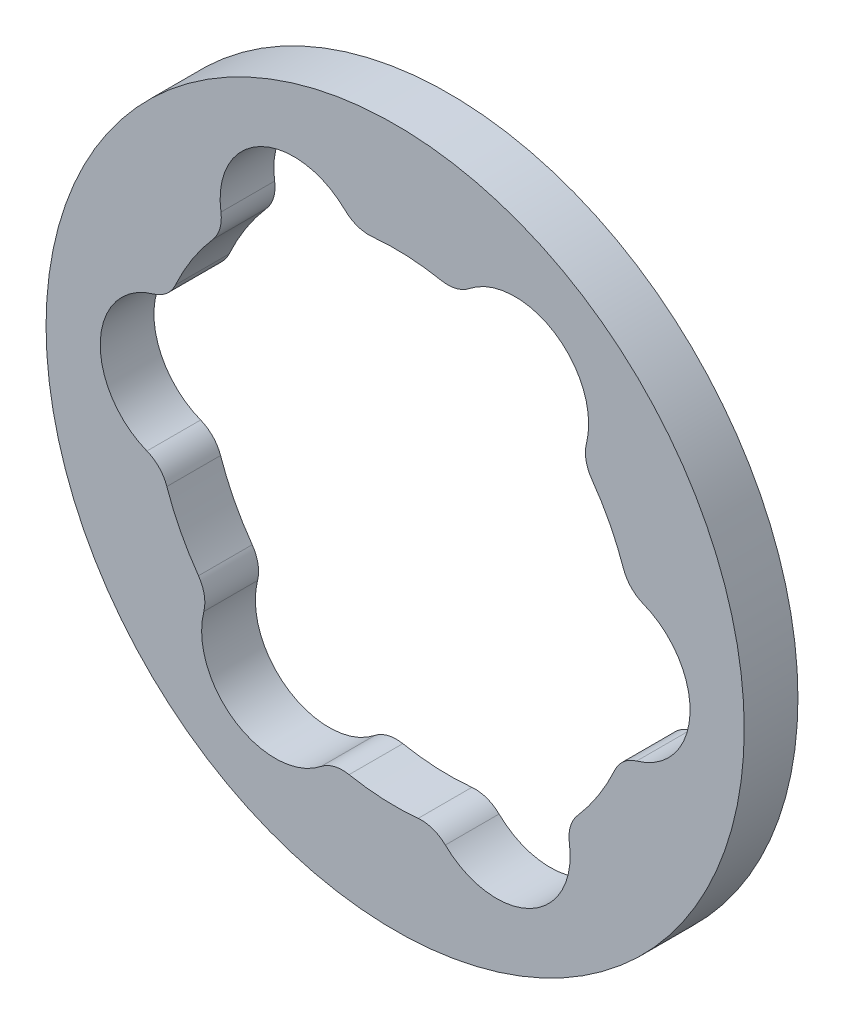
ISO-10303-21;
HEADER;
FILE_DESCRIPTION(('STEP AP214'),'2;1');
FILE_NAME('part.step','',(''),(''),'','','');
FILE_SCHEMA(('AUTOMOTIVE_DESIGN { 1 0 10303 214 1 1 1 1 }'));
ENDSEC;
DATA;
#1=APPLICATION_CONTEXT('core data for automotive mechanical design processes');
#2=APPLICATION_PROTOCOL_DEFINITION('international standard','automotive_design',2000,#1);
#3=PRODUCT_CONTEXT('',#1,'mechanical');
#4=PRODUCT('Part','Part','',(#3));
#5=PRODUCT_RELATED_PRODUCT_CATEGORY('part','',(#4));
#6=PRODUCT_DEFINITION_FORMATION('','',#4);
#7=PRODUCT_DEFINITION_CONTEXT('part definition',#1,'design');
#8=PRODUCT_DEFINITION('design','',#6,#7);
#9=PRODUCT_DEFINITION_SHAPE('','',#8);
#10=(LENGTH_UNIT() NAMED_UNIT(*) SI_UNIT(.MILLI.,.METRE.));
#11=(NAMED_UNIT(*) PLANE_ANGLE_UNIT() SI_UNIT($,.RADIAN.));
#12=(NAMED_UNIT(*) SI_UNIT($,.STERADIAN.) SOLID_ANGLE_UNIT());
#13=UNCERTAINTY_MEASURE_WITH_UNIT(LENGTH_MEASURE(1.E-05),#10,'distance_accuracy_value','');
#14=(GEOMETRIC_REPRESENTATION_CONTEXT(3) GLOBAL_UNCERTAINTY_ASSIGNED_CONTEXT((#13)) GLOBAL_UNIT_ASSIGNED_CONTEXT((#10,
#11,#12)) REPRESENTATION_CONTEXT('',''));
#15=CARTESIAN_POINT('',(0.,0.,0.));
#16=DIRECTION('',(0.,0.,1.));
#17=DIRECTION('',(1.,0.,0.));
#18=AXIS2_PLACEMENT_3D('',#15,#16,#17);
#19=CARTESIAN_POINT('',(0.,0.,3.175));
#20=DIRECTION('',(0.,0.,1.));
#21=DIRECTION('',(1.,0.,0.));
#22=AXIS2_PLACEMENT_3D('',#19,#20,#21);
#23=PLANE('',#22);
#24=CARTESIAN_POINT('',(596.895342550677,221.989731649152,3.175));
#25=DIRECTION('',(0.,0.,1.));
#26=DIRECTION('',(1.,0.,0.));
#27=AXIS2_PLACEMENT_3D('',#24,#25,#26);
#28=CIRCLE('',#27,20.6375);
#29=CARTESIAN_POINT('',(617.532842550677,221.989731649152,3.175));
#30=VERTEX_POINT('',#29);
#31=EDGE_CURVE('E244',#30,#30,#28,.T.);
#32=ORIENTED_EDGE('',*,*,#31,.T.);
#33=EDGE_LOOP('',(#32));
#34=FACE_BOUND('',#33,.T.);
#35=CARTESIAN_POINT('',(603.982524474659,233.003358987227,3.175));
#36=DIRECTION('',(0.,0.,1.));
#37=DIRECTION('',(1.,0.,0.));
#38=AXIS2_PLACEMENT_3D('',#35,#36,#37);
#39=CIRCLE('',#38,4.35292499999982);
#40=CARTESIAN_POINT('',(608.204995238954,231.945674393266,3.175));
#41=VERTEX_POINT('',#40);
#42=CARTESIAN_POINT('',(601.270344718915,236.408067055205,3.175));
#43=VERTEX_POINT('',#42);
#44=EDGE_CURVE('E345',#41,#43,#39,.T.);
#45=ORIENTED_EDGE('',*,*,#44,.F.);
#46=CARTESIAN_POINT('',(610.176097565101,231.451933955531,3.175));
#47=DIRECTION('',(0.,0.,1.));
#48=DIRECTION('',(1.,0.,0.));
#49=AXIS2_PLACEMENT_3D('',#46,#47,#48);
#50=CIRCLE('',#49,2.032);
#51=CARTESIAN_POINT('',(608.521174821871,230.272843325452,3.175));
#52=VERTEX_POINT('',#51);
#53=EDGE_CURVE('E293',#41,#52,#50,.T.);
#54=ORIENTED_EDGE('',*,*,#53,.T.);
#55=CARTESIAN_POINT('',(596.895342550677,221.989731649152,3.175));
#56=DIRECTION('',(0.,0.,1.));
#57=DIRECTION('',(1.,0.,0.));
#58=AXIS2_PLACEMENT_3D('',#55,#56,#57);
#59=CIRCLE('',#58,14.2748000000001);
#60=CARTESIAN_POINT('',(610.391687265941,226.639311669622,3.175));
#61=VERTEX_POINT('',#60);
#62=EDGE_CURVE('E358',#61,#52,#59,.T.);
#63=ORIENTED_EDGE('',*,*,#62,.F.);
#64=CARTESIAN_POINT('',(612.312875125765,227.301173594244,3.175));
#65=DIRECTION('',(0.,0.,1.));
#66=DIRECTION('',(1.,0.,0.));
#67=AXIS2_PLACEMENT_3D('',#64,#65,#66);
#68=CIRCLE('',#67,2.032);
#69=CARTESIAN_POINT('',(611.569488376722,225.410036332873,3.175));
#70=VERTEX_POINT('',#69);
#71=EDGE_CURVE('E239',#61,#70,#68,.T.);
#72=ORIENTED_EDGE('',*,*,#71,.T.);
#73=CARTESIAN_POINT('',(609.977014575256,221.358865730779,3.175));
#74=DIRECTION('',(0.,0.,1.));
#75=DIRECTION('',(1.,0.,0.));
#76=AXIS2_PLACEMENT_3D('',#73,#74,#75);
#77=CIRCLE('',#76,4.35292500000003);
#78=CARTESIAN_POINT('',(611.172268229842,217.173256485182,3.175));
#79=VERTEX_POINT('',#78);
#80=EDGE_CURVE('E343',#79,#70,#77,.T.);
#81=ORIENTED_EDGE('',*,*,#80,.F.);
#82=CARTESIAN_POINT('',(611.730227630961,215.219361578412,3.175));
#83=DIRECTION('',(0.,0.,1.));
#84=DIRECTION('',(1.,0.,0.));
#85=AXIS2_PLACEMENT_3D('',#82,#83,#84);
#86=CIRCLE('',#85,2.032);
#87=CARTESIAN_POINT('',(609.881643820334,216.063021400311,3.175));
#88=VERTEX_POINT('',#87);
#89=EDGE_CURVE('E276',#79,#88,#86,.T.);
#90=ORIENTED_EDGE('',*,*,#89,.T.);
#91=CARTESIAN_POINT('',(607.670169322965,212.626344277736,3.175));
#92=VERTEX_POINT('',#91);
#93=EDGE_CURVE('E364',#92,#88,#59,.T.);
#94=ORIENTED_EDGE('',*,*,#93,.F.);
#95=CARTESIAN_POINT('',(609.203952493397,211.293477747997,3.175));
#96=DIRECTION('',(0.,0.,1.));
#97=DIRECTION('',(1.,0.,0.));
#98=AXIS2_PLACEMENT_3D('',#95,#96,#97);
#99=CIRCLE('',#98,2.032);
#100=CARTESIAN_POINT('',(607.194486208485,210.991700926819,3.175));
#101=VERTEX_POINT('',#100);
#102=EDGE_CURVE('E278',#92,#101,#99,.T.);
#103=ORIENTED_EDGE('',*,*,#102,.T.);
#104=CARTESIAN_POINT('',(602.889832651274,210.345238392703,3.175));
#105=DIRECTION('',(0.,0.,1.));
#106=DIRECTION('',(1.,0.,0.));
#107=AXIS2_PLACEMENT_3D('',#104,#105,#106);
#108=CIRCLE('',#107,4.35292499999991);
#109=CARTESIAN_POINT('',(599.862615541565,207.217313741068,3.175));
#110=VERTEX_POINT('',#109);
#111=EDGE_CURVE('E360',#110,#101,#108,.T.);
#112=ORIENTED_EDGE('',*,*,#111,.F.);
#113=CARTESIAN_POINT('',(598.449472616536,205.757159272033,3.175));
#114=DIRECTION('',(0.,0.,1.));
#115=DIRECTION('',(1.,0.,0.));
#116=AXIS2_PLACEMENT_3D('',#113,#114,#115);
#117=CIRCLE('',#116,2.032);
#118=CARTESIAN_POINT('',(598.255811549139,207.779909724011,3.175));
#119=VERTEX_POINT('',#118);
#120=EDGE_CURVE('E280',#110,#119,#117,.T.);
#121=ORIENTED_EDGE('',*,*,#120,.T.);
#122=CARTESIAN_POINT('',(594.1738246077,207.976764257266,3.175));
#123=VERTEX_POINT('',#122);
#124=EDGE_CURVE('E363',#123,#119,#59,.T.);
#125=ORIENTED_EDGE('',*,*,#124,.F.);
#126=CARTESIAN_POINT('',(593.786419918309,205.982035802905,3.175));
#127=DIRECTION('',(0.,0.,1.));
#128=DIRECTION('',(1.,0.,0.));
#129=AXIS2_PLACEMENT_3D('',#126,#127,#128);
#130=CIRCLE('',#129,2.032);
#131=CARTESIAN_POINT('',(592.520340382439,207.571396243099,3.175));
#132=VERTEX_POINT('',#131);
#133=EDGE_CURVE('E282',#123,#132,#130,.T.);
#134=ORIENTED_EDGE('',*,*,#133,.T.);
#135=CARTESIAN_POINT('',(589.808160626695,210.976104311076,3.175));
#136=DIRECTION('',(0.,0.,1.));
#137=DIRECTION('',(1.,0.,0.));
#138=AXIS2_PLACEMENT_3D('',#135,#136,#137);
#139=CIRCLE('',#138,4.35292499999991);
#140=CARTESIAN_POINT('',(585.5856898624,212.033788905038,3.175));
#141=VERTEX_POINT('',#140);
#142=EDGE_CURVE('E365',#141,#132,#139,.T.);
#143=ORIENTED_EDGE('',*,*,#142,.F.);
#144=CARTESIAN_POINT('',(583.614587536252,212.527529342773,3.175));
#145=DIRECTION('',(0.,0.,1.));
#146=DIRECTION('',(1.,0.,0.));
#147=AXIS2_PLACEMENT_3D('',#144,#145,#146);
#148=CIRCLE('',#147,2.032);
#149=CARTESIAN_POINT('',(585.269510279483,213.706619972851,3.175));
#150=VERTEX_POINT('',#149);
#151=EDGE_CURVE('E284',#141,#150,#148,.T.);
#152=ORIENTED_EDGE('',*,*,#151,.T.);
#153=CARTESIAN_POINT('',(583.398997835413,217.340151628681,3.175));
#154=VERTEX_POINT('',#153);
#155=EDGE_CURVE('E368',#154,#150,#59,.T.);
#156=ORIENTED_EDGE('',*,*,#155,.F.);
#157=CARTESIAN_POINT('',(581.477809975588,216.678289704059,3.175));
#158=DIRECTION('',(0.,0.,1.));
#159=DIRECTION('',(1.,0.,0.));
#160=AXIS2_PLACEMENT_3D('',#157,#158,#159);
#161=CIRCLE('',#160,2.032);
#162=CARTESIAN_POINT('',(582.221196724632,218.569426965431,3.175));
#163=VERTEX_POINT('',#162);
#164=EDGE_CURVE('E273',#154,#163,#161,.T.);
#165=ORIENTED_EDGE('',*,*,#164,.T.);
#166=CARTESIAN_POINT('',(583.813670526097,222.620597567525,3.175));
#167=DIRECTION('',(0.,0.,1.));
#168=DIRECTION('',(1.,0.,0.));
#169=AXIS2_PLACEMENT_3D('',#166,#167,#168);
#170=CIRCLE('',#169,4.35292500000013);
#171=CARTESIAN_POINT('',(582.618416871512,226.806206813122,3.175));
#172=VERTEX_POINT('',#171);
#173=EDGE_CURVE('E369',#172,#163,#170,.T.);
#174=ORIENTED_EDGE('',*,*,#173,.F.);
#175=CARTESIAN_POINT('',(582.060457470393,228.760101719892,3.175));
#176=DIRECTION('',(0.,0.,1.));
#177=DIRECTION('',(1.,0.,0.));
#178=AXIS2_PLACEMENT_3D('',#175,#176,#177);
#179=CIRCLE('',#178,2.032);
#180=CARTESIAN_POINT('',(583.90904128102,227.916441897993,3.175));
#181=VERTEX_POINT('',#180);
#182=EDGE_CURVE('E286',#172,#181,#179,.T.);
#183=ORIENTED_EDGE('',*,*,#182,.T.);
#184=CARTESIAN_POINT('',(586.120515778389,231.353119020568,3.175));
#185=VERTEX_POINT('',#184);
#186=EDGE_CURVE('E359',#185,#181,#59,.T.);
#187=ORIENTED_EDGE('',*,*,#186,.F.);
#188=CARTESIAN_POINT('',(584.586732607957,232.685985550307,3.175));
#189=DIRECTION('',(0.,0.,1.));
#190=DIRECTION('',(1.,0.,0.));
#191=AXIS2_PLACEMENT_3D('',#188,#189,#190);
#192=CIRCLE('',#191,2.032);
#193=CARTESIAN_POINT('',(586.596198892869,232.987762371484,3.175));
#194=VERTEX_POINT('',#193);
#195=EDGE_CURVE('E288',#185,#194,#192,.T.);
#196=ORIENTED_EDGE('',*,*,#195,.T.);
#197=CARTESIAN_POINT('',(590.90085245008,233.6342249056,3.175));
#198=DIRECTION('',(0.,0.,1.));
#199=DIRECTION('',(1.,0.,0.));
#200=AXIS2_PLACEMENT_3D('',#197,#198,#199);
#201=CIRCLE('',#200,4.35292499999991);
#202=CARTESIAN_POINT('',(593.928069559789,236.762149557236,3.175));
#203=VERTEX_POINT('',#202);
#204=EDGE_CURVE('E352',#203,#194,#201,.T.);
#205=ORIENTED_EDGE('',*,*,#204,.F.);
#206=CARTESIAN_POINT('',(595.341212484818,238.22230402627,3.175));
#207=DIRECTION('',(0.,0.,1.));
#208=DIRECTION('',(1.,0.,0.));
#209=AXIS2_PLACEMENT_3D('',#206,#207,#208);
#210=CIRCLE('',#209,2.032);
#211=CARTESIAN_POINT('',(595.534873552214,236.199553574293,3.175));
#212=VERTEX_POINT('',#211);
#213=EDGE_CURVE('E66',#203,#212,#210,.T.);
#214=ORIENTED_EDGE('',*,*,#213,.T.);
#215=CARTESIAN_POINT('',(599.616860493654,236.002699041038,3.175));
#216=VERTEX_POINT('',#215);
#217=EDGE_CURVE('E355',#216,#212,#59,.T.);
#218=ORIENTED_EDGE('',*,*,#217,.F.);
#219=CARTESIAN_POINT('',(600.004265183046,237.997427495399,3.175));
#220=DIRECTION('',(0.,0.,1.));
#221=DIRECTION('',(1.,0.,0.));
#222=AXIS2_PLACEMENT_3D('',#219,#220,#221);
#223=CIRCLE('',#222,2.032);
#224=EDGE_CURVE('E291',#216,#43,#223,.T.);
#225=ORIENTED_EDGE('',*,*,#224,.T.);
#226=EDGE_LOOP('',(#45,#54,#63,#72,#81,#90,#94,#103,#112,#121,#125,#134,#143,#152,#156,#165,
#174,#183,#187,#196,#205,#214,#218,#225));
#227=FACE_BOUND('',#226,.T.);
#228=ADVANCED_FACE('F51',(#34,#227),#23,.T.);
#229=CARTESIAN_POINT('',(0.,0.,0.));
#230=DIRECTION('',(0.,0.,1.));
#231=DIRECTION('',(1.,0.,0.));
#232=AXIS2_PLACEMENT_3D('',#229,#230,#231);
#233=PLANE('',#232);
#234=CARTESIAN_POINT('',(596.895342550677,221.989731649152,0.));
#235=DIRECTION('',(0.,0.,1.));
#236=DIRECTION('',(1.,0.,0.));
#237=AXIS2_PLACEMENT_3D('',#234,#235,#236);
#238=CIRCLE('',#237,20.6375);
#239=CARTESIAN_POINT('',(617.532842550677,221.989731649152,0.));
#240=VERTEX_POINT('',#239);
#241=EDGE_CURVE('E356',#240,#240,#238,.T.);
#242=ORIENTED_EDGE('',*,*,#241,.F.);
#243=EDGE_LOOP('',(#242));
#244=FACE_BOUND('',#243,.T.);
#245=CARTESIAN_POINT('',(596.895342550677,221.989731649152,0.));
#246=DIRECTION('',(0.,0.,1.));
#247=DIRECTION('',(1.,0.,0.));
#248=AXIS2_PLACEMENT_3D('',#245,#246,#247);
#249=CIRCLE('',#248,14.2748000000001);
#250=CARTESIAN_POINT('',(610.391687265941,226.639311669622,0.));
#251=VERTEX_POINT('',#250);
#252=CARTESIAN_POINT('',(608.521174821871,230.272843325452,0.));
#253=VERTEX_POINT('',#252);
#254=EDGE_CURVE('E216',#251,#253,#249,.T.);
#255=ORIENTED_EDGE('',*,*,#254,.T.);
#256=CARTESIAN_POINT('',(610.176097565101,231.451933955531,0.));
#257=DIRECTION('',(0.,0.,1.));
#258=DIRECTION('',(1.,0.,0.));
#259=AXIS2_PLACEMENT_3D('',#256,#257,#258);
#260=CIRCLE('',#259,2.032);
#261=CARTESIAN_POINT('',(608.204995238954,231.945674393266,0.));
#262=VERTEX_POINT('',#261);
#263=EDGE_CURVE('E266',#253,#262,#260,.F.);
#264=ORIENTED_EDGE('',*,*,#263,.T.);
#265=CARTESIAN_POINT('',(603.982524474659,233.003358987227,0.));
#266=DIRECTION('',(0.,0.,1.));
#267=DIRECTION('',(1.,0.,0.));
#268=AXIS2_PLACEMENT_3D('',#265,#266,#267);
#269=CIRCLE('',#268,4.35292499999982);
#270=CARTESIAN_POINT('',(601.270344718915,236.408067055205,0.));
#271=VERTEX_POINT('',#270);
#272=EDGE_CURVE('E240',#271,#262,#269,.F.);
#273=ORIENTED_EDGE('',*,*,#272,.F.);
#274=CARTESIAN_POINT('',(600.004265183046,237.997427495399,0.));
#275=DIRECTION('',(0.,0.,1.));
#276=DIRECTION('',(1.,0.,0.));
#277=AXIS2_PLACEMENT_3D('',#274,#275,#276);
#278=CIRCLE('',#277,2.032);
#279=CARTESIAN_POINT('',(599.616860493654,236.002699041038,0.));
#280=VERTEX_POINT('',#279);
#281=EDGE_CURVE('E264',#271,#280,#278,.F.);
#282=ORIENTED_EDGE('',*,*,#281,.T.);
#283=CARTESIAN_POINT('',(595.534873552214,236.199553574293,0.));
#284=VERTEX_POINT('',#283);
#285=EDGE_CURVE('E235',#280,#284,#249,.T.);
#286=ORIENTED_EDGE('',*,*,#285,.T.);
#287=CARTESIAN_POINT('',(595.341212484818,238.22230402627,0.));
#288=DIRECTION('',(0.,0.,1.));
#289=DIRECTION('',(1.,0.,0.));
#290=AXIS2_PLACEMENT_3D('',#287,#288,#289);
#291=CIRCLE('',#290,2.032);
#292=CARTESIAN_POINT('',(593.928069559789,236.762149557236,0.));
#293=VERTEX_POINT('',#292);
#294=EDGE_CURVE('E262',#284,#293,#291,.F.);
#295=ORIENTED_EDGE('',*,*,#294,.T.);
#296=CARTESIAN_POINT('',(590.90085245008,233.6342249056,0.));
#297=DIRECTION('',(0.,0.,1.));
#298=DIRECTION('',(1.,0.,0.));
#299=AXIS2_PLACEMENT_3D('',#296,#297,#298);
#300=CIRCLE('',#299,4.35292499999991);
#301=CARTESIAN_POINT('',(586.596198892869,232.987762371484,0.));
#302=VERTEX_POINT('',#301);
#303=EDGE_CURVE('E348',#293,#302,#300,.T.);
#304=ORIENTED_EDGE('',*,*,#303,.T.);
#305=CARTESIAN_POINT('',(584.586732607957,232.685985550307,0.));
#306=DIRECTION('',(0.,0.,1.));
#307=DIRECTION('',(1.,0.,0.));
#308=AXIS2_PLACEMENT_3D('',#305,#306,#307);
#309=CIRCLE('',#308,2.032);
#310=CARTESIAN_POINT('',(586.120515778389,231.353119020568,0.));
#311=VERTEX_POINT('',#310);
#312=EDGE_CURVE('E260',#302,#311,#309,.F.);
#313=ORIENTED_EDGE('',*,*,#312,.T.);
#314=CARTESIAN_POINT('',(583.90904128102,227.916441897993,0.));
#315=VERTEX_POINT('',#314);
#316=EDGE_CURVE('E387',#311,#315,#249,.T.);
#317=ORIENTED_EDGE('',*,*,#316,.T.);
#318=CARTESIAN_POINT('',(582.060457470393,228.760101719892,0.));
#319=DIRECTION('',(0.,0.,1.));
#320=DIRECTION('',(1.,0.,0.));
#321=AXIS2_PLACEMENT_3D('',#318,#319,#320);
#322=CIRCLE('',#321,2.032);
#323=CARTESIAN_POINT('',(582.618416871512,226.806206813122,0.));
#324=VERTEX_POINT('',#323);
#325=EDGE_CURVE('E258',#315,#324,#322,.F.);
#326=ORIENTED_EDGE('',*,*,#325,.T.);
#327=CARTESIAN_POINT('',(583.813670526097,222.620597567525,0.));
#328=DIRECTION('',(0.,0.,1.));
#329=DIRECTION('',(1.,0.,0.));
#330=AXIS2_PLACEMENT_3D('',#327,#328,#329);
#331=CIRCLE('',#330,4.35292500000013);
#332=CARTESIAN_POINT('',(582.221196724632,218.569426965431,0.));
#333=VERTEX_POINT('',#332);
#334=EDGE_CURVE('E385',#324,#333,#331,.T.);
#335=ORIENTED_EDGE('',*,*,#334,.T.);
#336=CARTESIAN_POINT('',(581.477809975588,216.678289704059,0.));
#337=DIRECTION('',(0.,0.,1.));
#338=DIRECTION('',(1.,0.,0.));
#339=AXIS2_PLACEMENT_3D('',#336,#337,#338);
#340=CIRCLE('',#339,2.032);
#341=CARTESIAN_POINT('',(583.398997835413,217.340151628681,0.));
#342=VERTEX_POINT('',#341);
#343=EDGE_CURVE('E224',#333,#342,#340,.F.);
#344=ORIENTED_EDGE('',*,*,#343,.T.);
#345=CARTESIAN_POINT('',(585.269510279483,213.706619972851,0.));
#346=VERTEX_POINT('',#345);
#347=EDGE_CURVE('E384',#342,#346,#249,.T.);
#348=ORIENTED_EDGE('',*,*,#347,.T.);
#349=CARTESIAN_POINT('',(583.614587536252,212.527529342773,0.));
#350=DIRECTION('',(0.,0.,1.));
#351=DIRECTION('',(1.,0.,0.));
#352=AXIS2_PLACEMENT_3D('',#349,#350,#351);
#353=CIRCLE('',#352,2.032);
#354=CARTESIAN_POINT('',(585.5856898624,212.033788905038,0.));
#355=VERTEX_POINT('',#354);
#356=EDGE_CURVE('E256',#346,#355,#353,.F.);
#357=ORIENTED_EDGE('',*,*,#356,.T.);
#358=CARTESIAN_POINT('',(589.808160626695,210.976104311076,0.));
#359=DIRECTION('',(0.,0.,1.));
#360=DIRECTION('',(1.,0.,0.));
#361=AXIS2_PLACEMENT_3D('',#358,#359,#360);
#362=CIRCLE('',#361,4.35292499999991);
#363=CARTESIAN_POINT('',(592.520340382439,207.571396243099,0.));
#364=VERTEX_POINT('',#363);
#365=EDGE_CURVE('E381',#355,#364,#362,.T.);
#366=ORIENTED_EDGE('',*,*,#365,.T.);
#367=CARTESIAN_POINT('',(593.786419918309,205.982035802905,0.));
#368=DIRECTION('',(0.,0.,1.));
#369=DIRECTION('',(1.,0.,0.));
#370=AXIS2_PLACEMENT_3D('',#367,#368,#369);
#371=CIRCLE('',#370,2.032);
#372=CARTESIAN_POINT('',(594.1738246077,207.976764257266,0.));
#373=VERTEX_POINT('',#372);
#374=EDGE_CURVE('E254',#364,#373,#371,.F.);
#375=ORIENTED_EDGE('',*,*,#374,.T.);
#376=CARTESIAN_POINT('',(598.255811549139,207.779909724011,0.));
#377=VERTEX_POINT('',#376);
#378=EDGE_CURVE('E378',#373,#377,#249,.T.);
#379=ORIENTED_EDGE('',*,*,#378,.T.);
#380=CARTESIAN_POINT('',(598.449472616536,205.757159272033,0.));
#381=DIRECTION('',(0.,0.,1.));
#382=DIRECTION('',(1.,0.,0.));
#383=AXIS2_PLACEMENT_3D('',#380,#381,#382);
#384=CIRCLE('',#383,2.032);
#385=CARTESIAN_POINT('',(599.862615541565,207.217313741068,0.));
#386=VERTEX_POINT('',#385);
#387=EDGE_CURVE('E252',#377,#386,#384,.F.);
#388=ORIENTED_EDGE('',*,*,#387,.T.);
#389=CARTESIAN_POINT('',(602.889832651274,210.345238392703,0.));
#390=DIRECTION('',(0.,0.,1.));
#391=DIRECTION('',(1.,0.,0.));
#392=AXIS2_PLACEMENT_3D('',#389,#390,#391);
#393=CIRCLE('',#392,4.35292499999991);
#394=CARTESIAN_POINT('',(607.194486208485,210.991700926819,0.));
#395=VERTEX_POINT('',#394);
#396=EDGE_CURVE('E377',#386,#395,#393,.T.);
#397=ORIENTED_EDGE('',*,*,#396,.T.);
#398=CARTESIAN_POINT('',(609.203952493397,211.293477747997,0.));
#399=DIRECTION('',(0.,0.,1.));
#400=DIRECTION('',(1.,0.,0.));
#401=AXIS2_PLACEMENT_3D('',#398,#399,#400);
#402=CIRCLE('',#401,2.032);
#403=CARTESIAN_POINT('',(607.670169322965,212.626344277736,0.));
#404=VERTEX_POINT('',#403);
#405=EDGE_CURVE('E250',#395,#404,#402,.F.);
#406=ORIENTED_EDGE('',*,*,#405,.T.);
#407=CARTESIAN_POINT('',(609.881643820334,216.063021400311,0.));
#408=VERTEX_POINT('',#407);
#409=EDGE_CURVE('E234',#404,#408,#249,.T.);
#410=ORIENTED_EDGE('',*,*,#409,.T.);
#411=CARTESIAN_POINT('',(611.730227630961,215.219361578412,0.));
#412=DIRECTION('',(0.,0.,1.));
#413=DIRECTION('',(1.,0.,0.));
#414=AXIS2_PLACEMENT_3D('',#411,#412,#413);
#415=CIRCLE('',#414,2.032);
#416=CARTESIAN_POINT('',(611.172268229842,217.173256485182,0.));
#417=VERTEX_POINT('',#416);
#418=EDGE_CURVE('E223',#408,#417,#415,.F.);
#419=ORIENTED_EDGE('',*,*,#418,.T.);
#420=CARTESIAN_POINT('',(609.977014575256,221.358865730779,0.));
#421=DIRECTION('',(0.,0.,1.));
#422=DIRECTION('',(1.,0.,0.));
#423=AXIS2_PLACEMENT_3D('',#420,#421,#422);
#424=CIRCLE('',#423,4.35292500000003);
#425=CARTESIAN_POINT('',(611.569488376722,225.410036332873,0.));
#426=VERTEX_POINT('',#425);
#427=EDGE_CURVE('E218',#417,#426,#424,.T.);
#428=ORIENTED_EDGE('',*,*,#427,.T.);
#429=CARTESIAN_POINT('',(612.312875125765,227.301173594244,0.));
#430=DIRECTION('',(0.,0.,1.));
#431=DIRECTION('',(1.,0.,0.));
#432=AXIS2_PLACEMENT_3D('',#429,#430,#431);
#433=CIRCLE('',#432,2.032);
#434=EDGE_CURVE('E213',#426,#251,#433,.F.);
#435=ORIENTED_EDGE('',*,*,#434,.T.);
#436=EDGE_LOOP('',(#255,#264,#273,#282,#286,#295,#304,#313,#317,#326,#335,#344,#348,#357,#366,
#375,#379,#388,#397,#406,#410,#419,#428,#435));
#437=FACE_BOUND('',#436,.T.);
#438=ADVANCED_FACE('F215',(#244,#437),#233,.F.);
#439=CARTESIAN_POINT('',(590.90085245008,233.6342249056,3.175));
#440=DIRECTION('',(0.,0.,-1.));
#441=DIRECTION('',(-1.,0.,0.));
#442=AXIS2_PLACEMENT_3D('',#439,#440,#441);
#443=CYLINDRICAL_SURFACE('',#442,4.35292499999991);
#444=ORIENTED_EDGE('',*,*,#303,.F.);
#445=DIRECTION('',(0.,0.,-1.));
#446=VECTOR('',#445,1.);
#447=CARTESIAN_POINT('',(593.928069559789,236.762149557236,3.175));
#448=LINE('',#447,#446);
#449=EDGE_CURVE('E302',#293,#203,#448,.F.);
#450=ORIENTED_EDGE('',*,*,#449,.T.);
#451=ORIENTED_EDGE('',*,*,#204,.T.);
#452=DIRECTION('',(0.,0.,-1.));
#453=VECTOR('',#452,1.);
#454=CARTESIAN_POINT('',(586.596198892869,232.987762371484,3.175));
#455=LINE('',#454,#453);
#456=EDGE_CURVE('E299',#194,#302,#455,.T.);
#457=ORIENTED_EDGE('',*,*,#456,.T.);
#458=EDGE_LOOP('',(#444,#450,#451,#457));
#459=FACE_BOUND('',#458,.T.);
#460=ADVANCED_FACE('F453',(#459),#443,.F.);
#461=CARTESIAN_POINT('',(596.895342550677,221.989731649152,3.175));
#462=DIRECTION('',(0.,0.,-1.));
#463=DIRECTION('',(-1.,0.,0.));
#464=AXIS2_PLACEMENT_3D('',#461,#462,#463);
#465=CYLINDRICAL_SURFACE('',#464,14.2748000000001);
#466=ORIENTED_EDGE('',*,*,#285,.F.);
#467=DIRECTION('',(0.,0.,-1.));
#468=VECTOR('',#467,1.);
#469=CARTESIAN_POINT('',(599.616860493654,236.002699041038,3.175));
#470=LINE('',#469,#468);
#471=EDGE_CURVE('E73',#280,#216,#470,.F.);
#472=ORIENTED_EDGE('',*,*,#471,.T.);
#473=ORIENTED_EDGE('',*,*,#217,.T.);
#474=DIRECTION('',(0.,0.,-1.));
#475=VECTOR('',#474,1.);
#476=CARTESIAN_POINT('',(595.534873552214,236.199553574293,3.175));
#477=LINE('',#476,#475);
#478=EDGE_CURVE('E295',#212,#284,#477,.T.);
#479=ORIENTED_EDGE('',*,*,#478,.T.);
#480=EDGE_LOOP('',(#466,#472,#473,#479));
#481=FACE_BOUND('',#480,.T.);
#482=ADVANCED_FACE('F466',(#481),#465,.F.);
#483=ORIENTED_EDGE('',*,*,#62,.T.);
#484=DIRECTION('',(0.,0.,-1.));
#485=VECTOR('',#484,1.);
#486=CARTESIAN_POINT('',(608.521174821871,230.272843325452,3.175));
#487=LINE('',#486,#485);
#488=EDGE_CURVE('E233',#52,#253,#487,.T.);
#489=ORIENTED_EDGE('',*,*,#488,.T.);
#490=ORIENTED_EDGE('',*,*,#254,.F.);
#491=DIRECTION('',(0.,0.,-1.));
#492=VECTOR('',#491,1.);
#493=CARTESIAN_POINT('',(610.391687265941,226.639311669622,3.175));
#494=LINE('',#493,#492);
#495=EDGE_CURVE('E230',#251,#61,#494,.F.);
#496=ORIENTED_EDGE('',*,*,#495,.T.);
#497=EDGE_LOOP('',(#483,#489,#490,#496));
#498=FACE_BOUND('',#497,.T.);
#499=ADVANCED_FACE('F229',(#498),#465,.F.);
#500=ORIENTED_EDGE('',*,*,#409,.F.);
#501=DIRECTION('',(0.,0.,-1.));
#502=VECTOR('',#501,1.);
#503=CARTESIAN_POINT('',(607.670169322965,212.626344277736,3.175));
#504=LINE('',#503,#502);
#505=EDGE_CURVE('E337',#404,#92,#504,.F.);
#506=ORIENTED_EDGE('',*,*,#505,.T.);
#507=ORIENTED_EDGE('',*,*,#93,.T.);
#508=DIRECTION('',(0.,0.,-1.));
#509=VECTOR('',#508,1.);
#510=CARTESIAN_POINT('',(609.881643820334,216.063021400311,3.175));
#511=LINE('',#510,#509);
#512=EDGE_CURVE('E334',#88,#408,#511,.T.);
#513=ORIENTED_EDGE('',*,*,#512,.T.);
#514=EDGE_LOOP('',(#500,#506,#507,#513));
#515=FACE_BOUND('',#514,.T.);
#516=ADVANCED_FACE('F474',(#515),#465,.F.);
#517=CARTESIAN_POINT('',(602.889832651274,210.345238392703,3.175));
#518=DIRECTION('',(0.,0.,-1.));
#519=DIRECTION('',(-1.,0.,0.));
#520=AXIS2_PLACEMENT_3D('',#517,#518,#519);
#521=CYLINDRICAL_SURFACE('',#520,4.35292499999991);
#522=ORIENTED_EDGE('',*,*,#396,.F.);
#523=DIRECTION('',(0.,0.,-1.));
#524=VECTOR('',#523,1.);
#525=CARTESIAN_POINT('',(599.862615541565,207.217313741068,3.175));
#526=LINE('',#525,#524);
#527=EDGE_CURVE('E332',#386,#110,#526,.F.);
#528=ORIENTED_EDGE('',*,*,#527,.T.);
#529=ORIENTED_EDGE('',*,*,#111,.T.);
#530=DIRECTION('',(0.,0.,-1.));
#531=VECTOR('',#530,1.);
#532=CARTESIAN_POINT('',(607.194486208485,210.991700926819,3.175));
#533=LINE('',#532,#531);
#534=EDGE_CURVE('E329',#101,#395,#533,.T.);
#535=ORIENTED_EDGE('',*,*,#534,.T.);
#536=EDGE_LOOP('',(#522,#528,#529,#535));
#537=FACE_BOUND('',#536,.T.);
#538=ADVANCED_FACE('F471',(#537),#521,.F.);
#539=ORIENTED_EDGE('',*,*,#378,.F.);
#540=DIRECTION('',(0.,0.,-1.));
#541=VECTOR('',#540,1.);
#542=CARTESIAN_POINT('',(594.1738246077,207.976764257266,3.175));
#543=LINE('',#542,#541);
#544=EDGE_CURVE('E327',#373,#123,#543,.F.);
#545=ORIENTED_EDGE('',*,*,#544,.T.);
#546=ORIENTED_EDGE('',*,*,#124,.T.);
#547=DIRECTION('',(0.,0.,-1.));
#548=VECTOR('',#547,1.);
#549=CARTESIAN_POINT('',(598.255811549139,207.779909724011,3.175));
#550=LINE('',#549,#548);
#551=EDGE_CURVE('E324',#119,#377,#550,.T.);
#552=ORIENTED_EDGE('',*,*,#551,.T.);
#553=EDGE_LOOP('',(#539,#545,#546,#552));
#554=FACE_BOUND('',#553,.T.);
#555=ADVANCED_FACE('F401',(#554),#465,.F.);
#556=CARTESIAN_POINT('',(589.808160626695,210.976104311076,3.175));
#557=DIRECTION('',(0.,0.,-1.));
#558=DIRECTION('',(-1.,0.,0.));
#559=AXIS2_PLACEMENT_3D('',#556,#557,#558);
#560=CYLINDRICAL_SURFACE('',#559,4.35292499999991);
#561=ORIENTED_EDGE('',*,*,#365,.F.);
#562=DIRECTION('',(0.,0.,-1.));
#563=VECTOR('',#562,1.);
#564=CARTESIAN_POINT('',(585.5856898624,212.033788905038,3.175));
#565=LINE('',#564,#563);
#566=EDGE_CURVE('E322',#355,#141,#565,.F.);
#567=ORIENTED_EDGE('',*,*,#566,.T.);
#568=ORIENTED_EDGE('',*,*,#142,.T.);
#569=DIRECTION('',(0.,0.,-1.));
#570=VECTOR('',#569,1.);
#571=CARTESIAN_POINT('',(592.520340382439,207.571396243099,3.175));
#572=LINE('',#571,#570);
#573=EDGE_CURVE('E319',#132,#364,#572,.T.);
#574=ORIENTED_EDGE('',*,*,#573,.T.);
#575=EDGE_LOOP('',(#561,#567,#568,#574));
#576=FACE_BOUND('',#575,.T.);
#577=ADVANCED_FACE('F414',(#576),#560,.F.);
#578=ORIENTED_EDGE('',*,*,#155,.T.);
#579=DIRECTION('',(0.,0.,-1.));
#580=VECTOR('',#579,1.);
#581=CARTESIAN_POINT('',(585.269510279483,213.706619972851,3.175));
#582=LINE('',#581,#580);
#583=EDGE_CURVE('E316',#150,#346,#582,.T.);
#584=ORIENTED_EDGE('',*,*,#583,.T.);
#585=ORIENTED_EDGE('',*,*,#347,.F.);
#586=DIRECTION('',(0.,0.,-1.));
#587=VECTOR('',#586,1.);
#588=CARTESIAN_POINT('',(583.398997835413,217.340151628681,3.175));
#589=LINE('',#588,#587);
#590=EDGE_CURVE('E314',#342,#154,#589,.F.);
#591=ORIENTED_EDGE('',*,*,#590,.T.);
#592=EDGE_LOOP('',(#578,#584,#585,#591));
#593=FACE_BOUND('',#592,.T.);
#594=ADVANCED_FACE('F423',(#593),#465,.F.);
#595=CARTESIAN_POINT('',(583.813670526097,222.620597567525,3.175));
#596=DIRECTION('',(0.,0.,-1.));
#597=DIRECTION('',(-1.,0.,0.));
#598=AXIS2_PLACEMENT_3D('',#595,#596,#597);
#599=CYLINDRICAL_SURFACE('',#598,4.35292500000013);
#600=ORIENTED_EDGE('',*,*,#334,.F.);
#601=DIRECTION('',(0.,0.,-1.));
#602=VECTOR('',#601,1.);
#603=CARTESIAN_POINT('',(582.618416871512,226.806206813122,3.175));
#604=LINE('',#603,#602);
#605=EDGE_CURVE('E312',#324,#172,#604,.F.);
#606=ORIENTED_EDGE('',*,*,#605,.T.);
#607=ORIENTED_EDGE('',*,*,#173,.T.);
#608=DIRECTION('',(0.,0.,-1.));
#609=VECTOR('',#608,1.);
#610=CARTESIAN_POINT('',(582.221196724632,218.569426965431,3.175));
#611=LINE('',#610,#609);
#612=EDGE_CURVE('E309',#163,#333,#611,.T.);
#613=ORIENTED_EDGE('',*,*,#612,.T.);
#614=EDGE_LOOP('',(#600,#606,#607,#613));
#615=FACE_BOUND('',#614,.T.);
#616=ADVANCED_FACE('F438',(#615),#599,.F.);
#617=ORIENTED_EDGE('',*,*,#316,.F.);
#618=DIRECTION('',(0.,0.,-1.));
#619=VECTOR('',#618,1.);
#620=CARTESIAN_POINT('',(586.120515778389,231.353119020568,3.175));
#621=LINE('',#620,#619);
#622=EDGE_CURVE('E307',#311,#185,#621,.F.);
#623=ORIENTED_EDGE('',*,*,#622,.T.);
#624=ORIENTED_EDGE('',*,*,#186,.T.);
#625=DIRECTION('',(0.,0.,-1.));
#626=VECTOR('',#625,1.);
#627=CARTESIAN_POINT('',(583.90904128102,227.916441897993,3.175));
#628=LINE('',#627,#626);
#629=EDGE_CURVE('E304',#181,#315,#628,.T.);
#630=ORIENTED_EDGE('',*,*,#629,.T.);
#631=EDGE_LOOP('',(#617,#623,#624,#630));
#632=FACE_BOUND('',#631,.T.);
#633=ADVANCED_FACE('F429',(#632),#465,.F.);
#634=CARTESIAN_POINT('',(596.895342550677,221.989731649152,3.175));
#635=DIRECTION('',(0.,0.,-1.));
#636=DIRECTION('',(-1.,0.,0.));
#637=AXIS2_PLACEMENT_3D('',#634,#635,#636);
#638=CYLINDRICAL_SURFACE('',#637,20.6375);
#639=ORIENTED_EDGE('',*,*,#31,.F.);
#640=EDGE_LOOP('',(#639));
#641=FACE_BOUND('',#640,.T.);
#642=ORIENTED_EDGE('',*,*,#241,.T.);
#643=EDGE_LOOP('',(#642));
#644=FACE_BOUND('',#643,.T.);
#645=ADVANCED_FACE('F460',(#641,#644),#638,.T.);
#646=CARTESIAN_POINT('',(603.982524474659,233.003358987227,3.175));
#647=DIRECTION('',(0.,0.,-1.));
#648=DIRECTION('',(-1.,0.,0.));
#649=AXIS2_PLACEMENT_3D('',#646,#647,#648);
#650=CYLINDRICAL_SURFACE('',#649,4.35292499999982);
#651=ORIENTED_EDGE('',*,*,#272,.T.);
#652=DIRECTION('',(0.,0.,-1.));
#653=VECTOR('',#652,1.);
#654=CARTESIAN_POINT('',(608.204995238954,231.945674393266,3.175));
#655=LINE('',#654,#653);
#656=EDGE_CURVE('E271',#262,#41,#655,.F.);
#657=ORIENTED_EDGE('',*,*,#656,.T.);
#658=ORIENTED_EDGE('',*,*,#44,.T.);
#659=DIRECTION('',(0.,0.,-1.));
#660=VECTOR('',#659,1.);
#661=CARTESIAN_POINT('',(601.270344718915,236.408067055205,3.175));
#662=LINE('',#661,#660);
#663=EDGE_CURVE('E268',#43,#271,#662,.T.);
#664=ORIENTED_EDGE('',*,*,#663,.T.);
#665=EDGE_LOOP('',(#651,#657,#658,#664));
#666=FACE_BOUND('',#665,.T.);
#667=ADVANCED_FACE('F457',(#666),#650,.F.);
#668=CARTESIAN_POINT('',(609.977014575256,221.358865730779,3.175));
#669=DIRECTION('',(0.,0.,-1.));
#670=DIRECTION('',(-1.,0.,0.));
#671=AXIS2_PLACEMENT_3D('',#668,#669,#670);
#672=CYLINDRICAL_SURFACE('',#671,4.35292500000003);
#673=ORIENTED_EDGE('',*,*,#427,.F.);
#674=DIRECTION('',(0.,0.,-1.));
#675=VECTOR('',#674,1.);
#676=CARTESIAN_POINT('',(611.172268229842,217.173256485182,3.175));
#677=LINE('',#676,#675);
#678=EDGE_CURVE('E12',#417,#79,#677,.F.);
#679=ORIENTED_EDGE('',*,*,#678,.T.);
#680=ORIENTED_EDGE('',*,*,#80,.T.);
#681=DIRECTION('',(0.,0.,-1.));
#682=VECTOR('',#681,1.);
#683=CARTESIAN_POINT('',(611.569488376722,225.410036332873,3.175));
#684=LINE('',#683,#682);
#685=EDGE_CURVE('E59',#70,#426,#684,.T.);
#686=ORIENTED_EDGE('',*,*,#685,.T.);
#687=EDGE_LOOP('',(#673,#679,#680,#686));
#688=FACE_BOUND('',#687,.T.);
#689=ADVANCED_FACE('F340',(#688),#672,.F.);
#690=CARTESIAN_POINT('',(610.176097565101,231.451933955531,3.175));
#691=DIRECTION('',(0.,0.,-1.));
#692=DIRECTION('',(-1.,0.,0.));
#693=AXIS2_PLACEMENT_3D('',#690,#691,#692);
#694=CYLINDRICAL_SURFACE('',#693,2.032);
#695=ORIENTED_EDGE('',*,*,#53,.F.);
#696=ORIENTED_EDGE('',*,*,#656,.F.);
#697=ORIENTED_EDGE('',*,*,#263,.F.);
#698=ORIENTED_EDGE('',*,*,#488,.F.);
#699=EDGE_LOOP('',(#695,#696,#697,#698));
#700=FACE_BOUND('',#699,.T.);
#701=ADVANCED_FACE('F479',(#700),#694,.T.);
#702=CARTESIAN_POINT('',(600.004265183046,237.997427495399,3.175));
#703=DIRECTION('',(0.,0.,-1.));
#704=DIRECTION('',(-1.,0.,0.));
#705=AXIS2_PLACEMENT_3D('',#702,#703,#704);
#706=CYLINDRICAL_SURFACE('',#705,2.032);
#707=ORIENTED_EDGE('',*,*,#224,.F.);
#708=ORIENTED_EDGE('',*,*,#471,.F.);
#709=ORIENTED_EDGE('',*,*,#281,.F.);
#710=ORIENTED_EDGE('',*,*,#663,.F.);
#711=EDGE_LOOP('',(#707,#708,#709,#710));
#712=FACE_BOUND('',#711,.T.);
#713=ADVANCED_FACE('F482',(#712),#706,.T.);
#714=CARTESIAN_POINT('',(595.341212484818,238.22230402627,3.175));
#715=DIRECTION('',(0.,0.,-1.));
#716=DIRECTION('',(-1.,0.,0.));
#717=AXIS2_PLACEMENT_3D('',#714,#715,#716);
#718=CYLINDRICAL_SURFACE('',#717,2.032);
#719=ORIENTED_EDGE('',*,*,#213,.F.);
#720=ORIENTED_EDGE('',*,*,#449,.F.);
#721=ORIENTED_EDGE('',*,*,#294,.F.);
#722=ORIENTED_EDGE('',*,*,#478,.F.);
#723=EDGE_LOOP('',(#719,#720,#721,#722));
#724=FACE_BOUND('',#723,.T.);
#725=ADVANCED_FACE('F486',(#724),#718,.T.);
#726=CARTESIAN_POINT('',(584.586732607957,232.685985550307,3.175));
#727=DIRECTION('',(0.,0.,-1.));
#728=DIRECTION('',(-1.,0.,0.));
#729=AXIS2_PLACEMENT_3D('',#726,#727,#728);
#730=CYLINDRICAL_SURFACE('',#729,2.032);
#731=ORIENTED_EDGE('',*,*,#195,.F.);
#732=ORIENTED_EDGE('',*,*,#622,.F.);
#733=ORIENTED_EDGE('',*,*,#312,.F.);
#734=ORIENTED_EDGE('',*,*,#456,.F.);
#735=EDGE_LOOP('',(#731,#732,#733,#734));
#736=FACE_BOUND('',#735,.T.);
#737=ADVANCED_FACE('F490',(#736),#730,.T.);
#738=CARTESIAN_POINT('',(582.060457470393,228.760101719892,3.175));
#739=DIRECTION('',(0.,0.,-1.));
#740=DIRECTION('',(-1.,0.,0.));
#741=AXIS2_PLACEMENT_3D('',#738,#739,#740);
#742=CYLINDRICAL_SURFACE('',#741,2.032);
#743=ORIENTED_EDGE('',*,*,#182,.F.);
#744=ORIENTED_EDGE('',*,*,#605,.F.);
#745=ORIENTED_EDGE('',*,*,#325,.F.);
#746=ORIENTED_EDGE('',*,*,#629,.F.);
#747=EDGE_LOOP('',(#743,#744,#745,#746));
#748=FACE_BOUND('',#747,.T.);
#749=ADVANCED_FACE('F434',(#748),#742,.T.);
#750=CARTESIAN_POINT('',(583.614587536252,212.527529342773,3.175));
#751=DIRECTION('',(0.,0.,-1.));
#752=DIRECTION('',(-1.,0.,0.));
#753=AXIS2_PLACEMENT_3D('',#750,#751,#752);
#754=CYLINDRICAL_SURFACE('',#753,2.032);
#755=ORIENTED_EDGE('',*,*,#151,.F.);
#756=ORIENTED_EDGE('',*,*,#566,.F.);
#757=ORIENTED_EDGE('',*,*,#356,.F.);
#758=ORIENTED_EDGE('',*,*,#583,.F.);
#759=EDGE_LOOP('',(#755,#756,#757,#758));
#760=FACE_BOUND('',#759,.T.);
#761=ADVANCED_FACE('F417',(#760),#754,.T.);
#762=CARTESIAN_POINT('',(593.786419918309,205.982035802905,3.175));
#763=DIRECTION('',(0.,0.,-1.));
#764=DIRECTION('',(-1.,0.,0.));
#765=AXIS2_PLACEMENT_3D('',#762,#763,#764);
#766=CYLINDRICAL_SURFACE('',#765,2.032);
#767=ORIENTED_EDGE('',*,*,#133,.F.);
#768=ORIENTED_EDGE('',*,*,#544,.F.);
#769=ORIENTED_EDGE('',*,*,#374,.F.);
#770=ORIENTED_EDGE('',*,*,#573,.F.);
#771=EDGE_LOOP('',(#767,#768,#769,#770));
#772=FACE_BOUND('',#771,.T.);
#773=ADVANCED_FACE('F407',(#772),#766,.T.);
#774=CARTESIAN_POINT('',(598.449472616536,205.757159272033,3.175));
#775=DIRECTION('',(0.,0.,-1.));
#776=DIRECTION('',(-1.,0.,0.));
#777=AXIS2_PLACEMENT_3D('',#774,#775,#776);
#778=CYLINDRICAL_SURFACE('',#777,2.032);
#779=ORIENTED_EDGE('',*,*,#120,.F.);
#780=ORIENTED_EDGE('',*,*,#527,.F.);
#781=ORIENTED_EDGE('',*,*,#387,.F.);
#782=ORIENTED_EDGE('',*,*,#551,.F.);
#783=EDGE_LOOP('',(#779,#780,#781,#782));
#784=FACE_BOUND('',#783,.T.);
#785=ADVANCED_FACE('F501',(#784),#778,.T.);
#786=CARTESIAN_POINT('',(609.203952493397,211.293477747997,3.175));
#787=DIRECTION('',(0.,0.,-1.));
#788=DIRECTION('',(-1.,0.,0.));
#789=AXIS2_PLACEMENT_3D('',#786,#787,#788);
#790=CYLINDRICAL_SURFACE('',#789,2.032);
#791=ORIENTED_EDGE('',*,*,#102,.F.);
#792=ORIENTED_EDGE('',*,*,#505,.F.);
#793=ORIENTED_EDGE('',*,*,#405,.F.);
#794=ORIENTED_EDGE('',*,*,#534,.F.);
#795=EDGE_LOOP('',(#791,#792,#793,#794));
#796=FACE_BOUND('',#795,.T.);
#797=ADVANCED_FACE('F504',(#796),#790,.T.);
#798=CARTESIAN_POINT('',(611.730227630961,215.219361578412,3.175));
#799=DIRECTION('',(0.,0.,-1.));
#800=DIRECTION('',(-1.,0.,0.));
#801=AXIS2_PLACEMENT_3D('',#798,#799,#800);
#802=CYLINDRICAL_SURFACE('',#801,2.032);
#803=ORIENTED_EDGE('',*,*,#89,.F.);
#804=ORIENTED_EDGE('',*,*,#678,.F.);
#805=ORIENTED_EDGE('',*,*,#418,.F.);
#806=ORIENTED_EDGE('',*,*,#512,.F.);
#807=EDGE_LOOP('',(#803,#804,#805,#806));
#808=FACE_BOUND('',#807,.T.);
#809=ADVANCED_FACE('F446',(#808),#802,.T.);
#810=CARTESIAN_POINT('',(612.312875125765,227.301173594244,3.175));
#811=DIRECTION('',(0.,0.,-1.));
#812=DIRECTION('',(-1.,0.,0.));
#813=AXIS2_PLACEMENT_3D('',#810,#811,#812);
#814=CYLINDRICAL_SURFACE('',#813,2.032);
#815=ORIENTED_EDGE('',*,*,#71,.F.);
#816=ORIENTED_EDGE('',*,*,#495,.F.);
#817=ORIENTED_EDGE('',*,*,#434,.F.);
#818=ORIENTED_EDGE('',*,*,#685,.F.);
#819=EDGE_LOOP('',(#815,#816,#817,#818));
#820=FACE_BOUND('',#819,.T.);
#821=ADVANCED_FACE('F238',(#820),#814,.T.);
#822=CARTESIAN_POINT('',(581.477809975588,216.678289704059,3.175));
#823=DIRECTION('',(0.,0.,-1.));
#824=DIRECTION('',(-1.,0.,0.));
#825=AXIS2_PLACEMENT_3D('',#822,#823,#824);
#826=CYLINDRICAL_SURFACE('',#825,2.032);
#827=ORIENTED_EDGE('',*,*,#164,.F.);
#828=ORIENTED_EDGE('',*,*,#590,.F.);
#829=ORIENTED_EDGE('',*,*,#343,.F.);
#830=ORIENTED_EDGE('',*,*,#612,.F.);
#831=EDGE_LOOP('',(#827,#828,#829,#830));
#832=FACE_BOUND('',#831,.T.);
#833=ADVANCED_FACE('F53',(#832),#826,.T.);
#834=CLOSED_SHELL('',(#228,#438,#460,#482,#499,#516,#538,#555,#577,#594,#616,#633,#645,#667,
#689,#701,#713,#725,#737,#749,#761,#773,#785,#797,#809,#821,#833));
#835=MANIFOLD_SOLID_BREP('B2',#834);
#836=ADVANCED_BREP_SHAPE_REPRESENTATION('',(#18,#835),#14);
#837=SHAPE_DEFINITION_REPRESENTATION(#9,#836);
ENDSEC;
END-ISO-10303-21;
